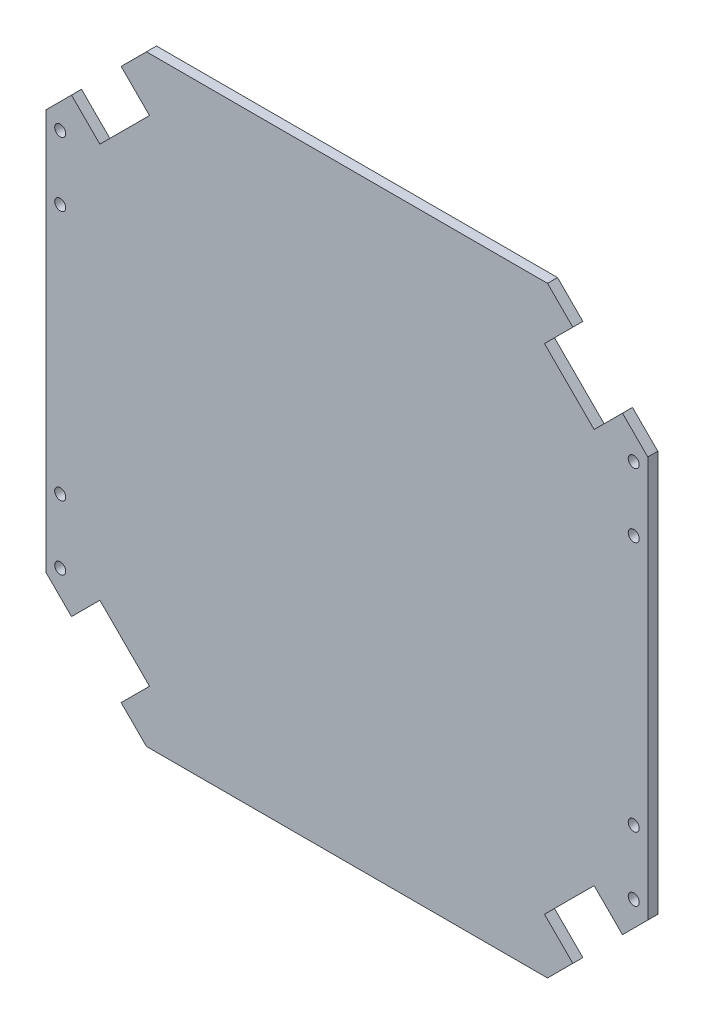
ISO-10303-21;
HEADER;
FILE_DESCRIPTION(('STEP AP214'),'2;1');
FILE_NAME('part.step','',(''),(''),'','','');
FILE_SCHEMA(('AUTOMOTIVE_DESIGN { 1 0 10303 214 1 1 1 1 }'));
ENDSEC;
DATA;
#1=APPLICATION_CONTEXT('core data for automotive mechanical design processes');
#2=APPLICATION_PROTOCOL_DEFINITION('international standard','automotive_design',2000,#1);
#3=PRODUCT_CONTEXT('',#1,'mechanical');
#4=PRODUCT('Part','Part','',(#3));
#5=PRODUCT_RELATED_PRODUCT_CATEGORY('part','',(#4));
#6=PRODUCT_DEFINITION_FORMATION('','',#4);
#7=PRODUCT_DEFINITION_CONTEXT('part definition',#1,'design');
#8=PRODUCT_DEFINITION('design','',#6,#7);
#9=PRODUCT_DEFINITION_SHAPE('','',#8);
#10=(LENGTH_UNIT() NAMED_UNIT(*) SI_UNIT(.MILLI.,.METRE.));
#11=(NAMED_UNIT(*) PLANE_ANGLE_UNIT() SI_UNIT($,.RADIAN.));
#12=(NAMED_UNIT(*) SI_UNIT($,.STERADIAN.) SOLID_ANGLE_UNIT());
#13=UNCERTAINTY_MEASURE_WITH_UNIT(LENGTH_MEASURE(1.E-05),#10,'distance_accuracy_value','');
#14=(GEOMETRIC_REPRESENTATION_CONTEXT(3) GLOBAL_UNCERTAINTY_ASSIGNED_CONTEXT((#13)) GLOBAL_UNIT_ASSIGNED_CONTEXT((#10,
#11,#12)) REPRESENTATION_CONTEXT('',''));
#15=CARTESIAN_POINT('',(0.,0.,0.));
#16=DIRECTION('',(0.,0.,1.));
#17=DIRECTION('',(1.,0.,0.));
#18=AXIS2_PLACEMENT_3D('',#15,#16,#17);
#19=CARTESIAN_POINT('',(110.857864376269,-110.85786437627,5.));
#20=DIRECTION('',(0.707106781186543,-0.707106781186552,0.));
#21=DIRECTION('',(0.707106781186552,0.707106781186543,0.));
#22=AXIS2_PLACEMENT_3D('',#19,#20,#21);
#23=PLANE('',#22);
#24=DIRECTION('',(-0.707106781186552,-0.707106781186543,0.));
#25=VECTOR('',#24,1.);
#26=CARTESIAN_POINT('',(110.857864376269,-110.85786437627,0.));
#27=LINE('',#26,#25);
#28=CARTESIAN_POINT('',(123.232233047034,-98.4834957055048,0.));
#29=VERTEX_POINT('',#28);
#30=CARTESIAN_POINT('',(98.4834957055044,-123.232233047034,0.));
#31=VERTEX_POINT('',#30);
#32=EDGE_CURVE('E232',#29,#31,#27,.T.);
#33=ORIENTED_EDGE('',*,*,#32,.F.);
#34=DIRECTION('',(0.,0.,-1.));
#35=VECTOR('',#34,1.);
#36=CARTESIAN_POINT('',(123.232233047034,-98.4834957055048,5.));
#37=LINE('',#36,#35);
#38=CARTESIAN_POINT('',(123.232233047034,-98.4834957055048,5.));
#39=VERTEX_POINT('',#38);
#40=EDGE_CURVE('E11',#39,#29,#37,.T.);
#41=ORIENTED_EDGE('',*,*,#40,.F.);
#42=DIRECTION('',(-0.707106781186552,-0.707106781186543,0.));
#43=VECTOR('',#42,1.);
#44=CARTESIAN_POINT('',(110.857864376269,-110.85786437627,5.));
#45=LINE('',#44,#43);
#46=CARTESIAN_POINT('',(98.4834957055044,-123.232233047034,5.));
#47=VERTEX_POINT('',#46);
#48=EDGE_CURVE('E288',#39,#47,#45,.T.);
#49=ORIENTED_EDGE('',*,*,#48,.T.);
#50=DIRECTION('',(0.,0.,-1.));
#51=VECTOR('',#50,1.);
#52=CARTESIAN_POINT('',(98.4834957055044,-123.232233047034,5.));
#53=LINE('',#52,#51);
#54=EDGE_CURVE('E55',#47,#31,#53,.T.);
#55=ORIENTED_EDGE('',*,*,#54,.T.);
#56=EDGE_LOOP('',(#33,#41,#49,#55));
#57=FACE_BOUND('',#56,.T.);
#58=ADVANCED_FACE('F39',(#57),#23,.T.);
#59=CARTESIAN_POINT('',(12.3743686707649,12.3743686707648,5.));
#60=DIRECTION('',(-0.70710678118655,-0.707106781186545,0.));
#61=DIRECTION('',(0.707106781186545,-0.70710678118655,0.));
#62=AXIS2_PLACEMENT_3D('',#59,#60,#61);
#63=PLANE('',#62);
#64=DIRECTION('',(-0.707106781186545,0.70710678118655,0.));
#65=VECTOR('',#64,1.);
#66=CARTESIAN_POINT('',(12.3743686707649,12.3743686707648,0.));
#67=LINE('',#66,#65);
#68=CARTESIAN_POINT('',(137.374368670765,-112.625631329236,0.));
#69=VERTEX_POINT('',#68);
#70=EDGE_CURVE('E234',#69,#29,#67,.T.);
#71=ORIENTED_EDGE('',*,*,#70,.F.);
#72=DIRECTION('',(0.,0.,-1.));
#73=VECTOR('',#72,1.);
#74=CARTESIAN_POINT('',(137.374368670765,-112.625631329236,5.));
#75=LINE('',#74,#73);
#76=CARTESIAN_POINT('',(137.374368670765,-112.625631329236,5.));
#77=VERTEX_POINT('',#76);
#78=EDGE_CURVE('E47',#77,#69,#75,.T.);
#79=ORIENTED_EDGE('',*,*,#78,.F.);
#80=DIRECTION('',(-0.707106781186545,0.70710678118655,0.));
#81=VECTOR('',#80,1.);
#82=CARTESIAN_POINT('',(12.3743686707649,12.3743686707648,5.));
#83=LINE('',#82,#81);
#84=EDGE_CURVE('E346',#77,#39,#83,.T.);
#85=ORIENTED_EDGE('',*,*,#84,.T.);
#86=ORIENTED_EDGE('',*,*,#40,.T.);
#87=EDGE_LOOP('',(#71,#79,#85,#86));
#88=FACE_BOUND('',#87,.T.);
#89=ADVANCED_FACE('F345',(#88),#63,.T.);
#90=CARTESIAN_POINT('',(124.999999999999,-125.000000000001,5.));
#91=DIRECTION('',(-0.707106781186544,0.707106781186552,0.));
#92=DIRECTION('',(-0.707106781186551,-0.707106781186544,0.));
#93=AXIS2_PLACEMENT_3D('',#90,#91,#92);
#94=PLANE('',#93);
#95=DIRECTION('',(0.707106781186552,0.707106781186544,0.));
#96=VECTOR('',#95,1.);
#97=CARTESIAN_POINT('',(124.999999999999,-125.000000000001,0.));
#98=LINE('',#97,#96);
#99=CARTESIAN_POINT('',(150.,-100.000000000001,0.));
#100=VERTEX_POINT('',#99);
#101=EDGE_CURVE('E238',#69,#100,#98,.T.);
#102=ORIENTED_EDGE('',*,*,#101,.T.);
#103=DIRECTION('',(0.,0.,-1.));
#104=VECTOR('',#103,1.);
#105=CARTESIAN_POINT('',(150.,-100.000000000001,5.));
#106=LINE('',#105,#104);
#107=CARTESIAN_POINT('',(150.,-100.000000000001,5.));
#108=VERTEX_POINT('',#107);
#109=EDGE_CURVE('E331',#108,#100,#106,.T.);
#110=ORIENTED_EDGE('',*,*,#109,.F.);
#111=DIRECTION('',(0.707106781186552,0.707106781186544,0.));
#112=VECTOR('',#111,1.);
#113=CARTESIAN_POINT('',(124.999999999999,-125.000000000001,5.));
#114=LINE('',#113,#112);
#115=EDGE_CURVE('E219',#77,#108,#114,.T.);
#116=ORIENTED_EDGE('',*,*,#115,.F.);
#117=ORIENTED_EDGE('',*,*,#78,.T.);
#118=EDGE_LOOP('',(#102,#110,#116,#117));
#119=FACE_BOUND('',#118,.T.);
#120=ADVANCED_FACE('F336',(#119),#94,.F.);
#121=CARTESIAN_POINT('',(150.,0.,5.));
#122=DIRECTION('',(-1.,0.,0.));
#123=DIRECTION('',(0.,0.,1.));
#124=AXIS2_PLACEMENT_3D('',#121,#122,#123);
#125=PLANE('',#124);
#126=DIRECTION('',(0.,1.,0.));
#127=VECTOR('',#126,1.);
#128=CARTESIAN_POINT('',(150.,0.,0.));
#129=LINE('',#128,#127);
#130=CARTESIAN_POINT('',(150.,100.000000000001,0.));
#131=VERTEX_POINT('',#130);
#132=EDGE_CURVE('E240',#100,#131,#129,.T.);
#133=ORIENTED_EDGE('',*,*,#132,.T.);
#134=DIRECTION('',(0.,0.,-1.));
#135=VECTOR('',#134,1.);
#136=CARTESIAN_POINT('',(150.,100.000000000001,5.));
#137=LINE('',#136,#135);
#138=CARTESIAN_POINT('',(150.,100.000000000001,5.));
#139=VERTEX_POINT('',#138);
#140=EDGE_CURVE('E329',#139,#131,#137,.T.);
#141=ORIENTED_EDGE('',*,*,#140,.F.);
#142=DIRECTION('',(0.,1.,0.));
#143=VECTOR('',#142,1.);
#144=CARTESIAN_POINT('',(150.,0.,5.));
#145=LINE('',#144,#143);
#146=EDGE_CURVE('E572',#108,#139,#145,.T.);
#147=ORIENTED_EDGE('',*,*,#146,.F.);
#148=ORIENTED_EDGE('',*,*,#109,.T.);
#149=EDGE_LOOP('',(#133,#141,#147,#148));
#150=FACE_BOUND('',#149,.T.);
#151=ADVANCED_FACE('F366',(#150),#125,.F.);
#152=CARTESIAN_POINT('',(124.999999999999,125.000000000001,5.));
#153=DIRECTION('',(0.707106781186544,0.707106781186552,0.));
#154=DIRECTION('',(-0.707106781186551,0.707106781186544,0.));
#155=AXIS2_PLACEMENT_3D('',#152,#153,#154);
#156=PLANE('',#155);
#157=DIRECTION('',(0.707106781186552,-0.707106781186544,0.));
#158=VECTOR('',#157,1.);
#159=CARTESIAN_POINT('',(124.999999999999,125.000000000001,0.));
#160=LINE('',#159,#158);
#161=CARTESIAN_POINT('',(137.374368670765,112.625631329236,0.));
#162=VERTEX_POINT('',#161);
#163=EDGE_CURVE('E244',#162,#131,#160,.T.);
#164=ORIENTED_EDGE('',*,*,#163,.F.);
#165=DIRECTION('',(0.,0.,-1.));
#166=VECTOR('',#165,1.);
#167=CARTESIAN_POINT('',(137.374368670765,112.625631329236,5.));
#168=LINE('',#167,#166);
#169=CARTESIAN_POINT('',(137.374368670765,112.625631329236,5.));
#170=VERTEX_POINT('',#169);
#171=EDGE_CURVE('E327',#170,#162,#168,.T.);
#172=ORIENTED_EDGE('',*,*,#171,.F.);
#173=DIRECTION('',(0.707106781186552,-0.707106781186544,0.));
#174=VECTOR('',#173,1.);
#175=CARTESIAN_POINT('',(124.999999999999,125.000000000001,5.));
#176=LINE('',#175,#174);
#177=EDGE_CURVE('E574',#170,#139,#176,.T.);
#178=ORIENTED_EDGE('',*,*,#177,.T.);
#179=ORIENTED_EDGE('',*,*,#140,.T.);
#180=EDGE_LOOP('',(#164,#172,#178,#179));
#181=FACE_BOUND('',#180,.T.);
#182=ADVANCED_FACE('F370',(#181),#156,.T.);
#183=CARTESIAN_POINT('',(12.3743686707649,-12.3743686707648,5.));
#184=DIRECTION('',(0.70710678118655,-0.707106781186545,0.));
#185=DIRECTION('',(0.707106781186545,0.70710678118655,0.));
#186=AXIS2_PLACEMENT_3D('',#183,#184,#185);
#187=PLANE('',#186);
#188=DIRECTION('',(-0.707106781186545,-0.70710678118655,0.));
#189=VECTOR('',#188,1.);
#190=CARTESIAN_POINT('',(12.3743686707649,-12.3743686707648,0.));
#191=LINE('',#190,#189);
#192=CARTESIAN_POINT('',(123.232233047034,98.4834957055048,0.));
#193=VERTEX_POINT('',#192);
#194=EDGE_CURVE('E247',#162,#193,#191,.T.);
#195=ORIENTED_EDGE('',*,*,#194,.T.);
#196=DIRECTION('',(0.,0.,-1.));
#197=VECTOR('',#196,1.);
#198=CARTESIAN_POINT('',(123.232233047034,98.4834957055048,5.));
#199=LINE('',#198,#197);
#200=CARTESIAN_POINT('',(123.232233047034,98.4834957055048,5.));
#201=VERTEX_POINT('',#200);
#202=EDGE_CURVE('E324',#201,#193,#199,.T.);
#203=ORIENTED_EDGE('',*,*,#202,.F.);
#204=DIRECTION('',(-0.707106781186545,-0.70710678118655,0.));
#205=VECTOR('',#204,1.);
#206=CARTESIAN_POINT('',(12.3743686707649,-12.3743686707648,5.));
#207=LINE('',#206,#205);
#208=EDGE_CURVE('E577',#170,#201,#207,.T.);
#209=ORIENTED_EDGE('',*,*,#208,.F.);
#210=ORIENTED_EDGE('',*,*,#171,.T.);
#211=EDGE_LOOP('',(#195,#203,#209,#210));
#212=FACE_BOUND('',#211,.T.);
#213=ADVANCED_FACE('F372',(#212),#187,.F.);
#214=CARTESIAN_POINT('',(110.857864376269,110.85786437627,5.));
#215=DIRECTION('',(-0.707106781186543,-0.707106781186552,0.));
#216=DIRECTION('',(0.707106781186552,-0.707106781186543,0.));
#217=AXIS2_PLACEMENT_3D('',#214,#215,#216);
#218=PLANE('',#217);
#219=DIRECTION('',(-0.707106781186552,0.707106781186543,0.));
#220=VECTOR('',#219,1.);
#221=CARTESIAN_POINT('',(110.857864376269,110.85786437627,0.));
#222=LINE('',#221,#220);
#223=CARTESIAN_POINT('',(98.4834957055045,123.232233047034,0.));
#224=VERTEX_POINT('',#223);
#225=EDGE_CURVE('E250',#193,#224,#222,.T.);
#226=ORIENTED_EDGE('',*,*,#225,.T.);
#227=DIRECTION('',(0.,0.,-1.));
#228=VECTOR('',#227,1.);
#229=CARTESIAN_POINT('',(98.4834957055045,123.232233047034,5.));
#230=LINE('',#229,#228);
#231=CARTESIAN_POINT('',(98.4834957055045,123.232233047034,5.));
#232=VERTEX_POINT('',#231);
#233=EDGE_CURVE('E321',#232,#224,#230,.T.);
#234=ORIENTED_EDGE('',*,*,#233,.F.);
#235=DIRECTION('',(-0.707106781186552,0.707106781186543,0.));
#236=VECTOR('',#235,1.);
#237=CARTESIAN_POINT('',(110.857864376269,110.85786437627,5.));
#238=LINE('',#237,#236);
#239=EDGE_CURVE('E580',#201,#232,#238,.T.);
#240=ORIENTED_EDGE('',*,*,#239,.F.);
#241=ORIENTED_EDGE('',*,*,#202,.T.);
#242=EDGE_LOOP('',(#226,#234,#240,#241));
#243=FACE_BOUND('',#242,.T.);
#244=ADVANCED_FACE('F375',(#243),#218,.F.);
#245=CARTESIAN_POINT('',(-12.3743686707643,12.3743686707642,5.));
#246=DIRECTION('',(-0.707106781186551,0.707106781186544,0.));
#247=DIRECTION('',(-0.707106781186544,-0.707106781186551,0.));
#248=AXIS2_PLACEMENT_3D('',#245,#246,#247);
#249=PLANE('',#248);
#250=DIRECTION('',(0.707106781186544,0.707106781186551,0.));
#251=VECTOR('',#250,1.);
#252=CARTESIAN_POINT('',(-12.3743686707643,12.3743686707642,0.));
#253=LINE('',#252,#251);
#254=CARTESIAN_POINT('',(112.625631329235,137.374368670765,0.));
#255=VERTEX_POINT('',#254);
#256=EDGE_CURVE('E252',#224,#255,#253,.T.);
#257=ORIENTED_EDGE('',*,*,#256,.T.);
#258=DIRECTION('',(0.,0.,-1.));
#259=VECTOR('',#258,1.);
#260=CARTESIAN_POINT('',(112.625631329235,137.374368670765,5.));
#261=LINE('',#260,#259);
#262=CARTESIAN_POINT('',(112.625631329235,137.374368670765,5.));
#263=VERTEX_POINT('',#262);
#264=EDGE_CURVE('E319',#263,#255,#261,.T.);
#265=ORIENTED_EDGE('',*,*,#264,.F.);
#266=DIRECTION('',(0.707106781186544,0.707106781186551,0.));
#267=VECTOR('',#266,1.);
#268=CARTESIAN_POINT('',(-12.3743686707643,12.3743686707642,5.));
#269=LINE('',#268,#267);
#270=EDGE_CURVE('E582',#232,#263,#269,.T.);
#271=ORIENTED_EDGE('',*,*,#270,.F.);
#272=ORIENTED_EDGE('',*,*,#233,.T.);
#273=EDGE_LOOP('',(#257,#265,#271,#272));
#274=FACE_BOUND('',#273,.T.);
#275=ADVANCED_FACE('F379',(#274),#249,.F.);
#276=CARTESIAN_POINT('',(100.,150.,0.));
#277=VERTEX_POINT('',#276);
#278=EDGE_CURVE('E248',#277,#255,#160,.T.);
#279=ORIENTED_EDGE('',*,*,#278,.F.);
#280=DIRECTION('',(0.,0.,-1.));
#281=VECTOR('',#280,1.);
#282=CARTESIAN_POINT('',(100.,150.,5.));
#283=LINE('',#282,#281);
#284=CARTESIAN_POINT('',(100.,150.,5.));
#285=VERTEX_POINT('',#284);
#286=EDGE_CURVE('E317',#285,#277,#283,.T.);
#287=ORIENTED_EDGE('',*,*,#286,.F.);
#288=EDGE_CURVE('E578',#285,#263,#176,.T.);
#289=ORIENTED_EDGE('',*,*,#288,.T.);
#290=ORIENTED_EDGE('',*,*,#264,.T.);
#291=EDGE_LOOP('',(#279,#287,#289,#290));
#292=FACE_BOUND('',#291,.T.);
#293=ADVANCED_FACE('F383',(#292),#156,.T.);
#294=CARTESIAN_POINT('',(0.,150.,5.));
#295=DIRECTION('',(0.,-1.,0.));
#296=DIRECTION('',(1.,0.,0.));
#297=AXIS2_PLACEMENT_3D('',#294,#295,#296);
#298=PLANE('',#297);
#299=DIRECTION('',(-1.,0.,0.));
#300=VECTOR('',#299,1.);
#301=CARTESIAN_POINT('',(0.,150.,0.));
#302=LINE('',#301,#300);
#303=CARTESIAN_POINT('',(-100.,150.,0.));
#304=VERTEX_POINT('',#303);
#305=EDGE_CURVE('E255',#277,#304,#302,.T.);
#306=ORIENTED_EDGE('',*,*,#305,.T.);
#307=DIRECTION('',(0.,0.,-1.));
#308=VECTOR('',#307,1.);
#309=CARTESIAN_POINT('',(-100.,150.,5.));
#310=LINE('',#309,#308);
#311=CARTESIAN_POINT('',(-100.,150.,5.));
#312=VERTEX_POINT('',#311);
#313=EDGE_CURVE('E314',#312,#304,#310,.T.);
#314=ORIENTED_EDGE('',*,*,#313,.F.);
#315=DIRECTION('',(-1.,0.,0.));
#316=VECTOR('',#315,1.);
#317=CARTESIAN_POINT('',(0.,150.,5.));
#318=LINE('',#317,#316);
#319=EDGE_CURVE('E584',#285,#312,#318,.T.);
#320=ORIENTED_EDGE('',*,*,#319,.F.);
#321=ORIENTED_EDGE('',*,*,#286,.T.);
#322=EDGE_LOOP('',(#306,#314,#320,#321));
#323=FACE_BOUND('',#322,.T.);
#324=ADVANCED_FACE('F387',(#323),#298,.F.);
#325=CARTESIAN_POINT('',(-124.999999999999,125.000000000001,5.));
#326=DIRECTION('',(0.707106781186543,-0.707106781186552,0.));
#327=DIRECTION('',(0.707106781186552,0.707106781186543,0.));
#328=AXIS2_PLACEMENT_3D('',#325,#326,#327);
#329=PLANE('',#328);
#330=DIRECTION('',(-0.707106781186552,-0.707106781186543,0.));
#331=VECTOR('',#330,1.);
#332=CARTESIAN_POINT('',(-124.999999999999,125.000000000001,0.));
#333=LINE('',#332,#331);
#334=CARTESIAN_POINT('',(-112.625631329235,137.374368670765,0.));
#335=VERTEX_POINT('',#334);
#336=EDGE_CURVE('E257',#304,#335,#333,.T.);
#337=ORIENTED_EDGE('',*,*,#336,.T.);
#338=DIRECTION('',(0.,0.,-1.));
#339=VECTOR('',#338,1.);
#340=CARTESIAN_POINT('',(-112.625631329235,137.374368670765,5.));
#341=LINE('',#340,#339);
#342=CARTESIAN_POINT('',(-112.625631329235,137.374368670765,5.));
#343=VERTEX_POINT('',#342);
#344=EDGE_CURVE('E312',#343,#335,#341,.T.);
#345=ORIENTED_EDGE('',*,*,#344,.F.);
#346=DIRECTION('',(-0.707106781186552,-0.707106781186543,0.));
#347=VECTOR('',#346,1.);
#348=CARTESIAN_POINT('',(-124.999999999999,125.000000000001,5.));
#349=LINE('',#348,#347);
#350=EDGE_CURVE('E586',#312,#343,#349,.T.);
#351=ORIENTED_EDGE('',*,*,#350,.F.);
#352=ORIENTED_EDGE('',*,*,#313,.T.);
#353=EDGE_LOOP('',(#337,#345,#351,#352));
#354=FACE_BOUND('',#353,.T.);
#355=ADVANCED_FACE('F391',(#354),#329,.F.);
#356=CARTESIAN_POINT('',(12.3743686707643,12.3743686707642,5.));
#357=DIRECTION('',(-0.707106781186551,-0.707106781186544,0.));
#358=DIRECTION('',(0.707106781186544,-0.707106781186551,0.));
#359=AXIS2_PLACEMENT_3D('',#356,#357,#358);
#360=PLANE('',#359);
#361=DIRECTION('',(-0.707106781186544,0.707106781186551,0.));
#362=VECTOR('',#361,1.);
#363=CARTESIAN_POINT('',(12.3743686707643,12.3743686707642,0.));
#364=LINE('',#363,#362);
#365=CARTESIAN_POINT('',(-98.4834957055044,123.232233047034,0.));
#366=VERTEX_POINT('',#365);
#367=EDGE_CURVE('E260',#366,#335,#364,.T.);
#368=ORIENTED_EDGE('',*,*,#367,.F.);
#369=DIRECTION('',(0.,0.,-1.));
#370=VECTOR('',#369,1.);
#371=CARTESIAN_POINT('',(-98.4834957055044,123.232233047034,5.));
#372=LINE('',#371,#370);
#373=CARTESIAN_POINT('',(-98.4834957055044,123.232233047034,5.));
#374=VERTEX_POINT('',#373);
#375=EDGE_CURVE('E310',#374,#366,#372,.T.);
#376=ORIENTED_EDGE('',*,*,#375,.F.);
#377=DIRECTION('',(-0.707106781186544,0.707106781186551,0.));
#378=VECTOR('',#377,1.);
#379=CARTESIAN_POINT('',(12.3743686707643,12.3743686707642,5.));
#380=LINE('',#379,#378);
#381=EDGE_CURVE('E588',#374,#343,#380,.T.);
#382=ORIENTED_EDGE('',*,*,#381,.T.);
#383=ORIENTED_EDGE('',*,*,#344,.T.);
#384=EDGE_LOOP('',(#368,#376,#382,#383));
#385=FACE_BOUND('',#384,.T.);
#386=ADVANCED_FACE('F393',(#385),#360,.T.);
#387=CARTESIAN_POINT('',(-110.857864376268,110.85786437627,5.));
#388=DIRECTION('',(-0.707106781186543,0.707106781186552,0.));
#389=DIRECTION('',(-0.707106781186552,-0.707106781186543,0.));
#390=AXIS2_PLACEMENT_3D('',#387,#388,#389);
#391=PLANE('',#390);
#392=DIRECTION('',(0.707106781186552,0.707106781186543,0.));
#393=VECTOR('',#392,1.);
#394=CARTESIAN_POINT('',(-110.857864376268,110.85786437627,0.));
#395=LINE('',#394,#393);
#396=CARTESIAN_POINT('',(-123.232233047031,98.4834957055074,0.));
#397=VERTEX_POINT('',#396);
#398=EDGE_CURVE('E264',#397,#366,#395,.T.);
#399=ORIENTED_EDGE('',*,*,#398,.F.);
#400=DIRECTION('',(0.,0.,-1.));
#401=VECTOR('',#400,1.);
#402=CARTESIAN_POINT('',(-123.232233047031,98.4834957055074,5.));
#403=LINE('',#402,#401);
#404=CARTESIAN_POINT('',(-123.232233047031,98.4834957055074,5.));
#405=VERTEX_POINT('',#404);
#406=EDGE_CURVE('E308',#405,#397,#403,.T.);
#407=ORIENTED_EDGE('',*,*,#406,.F.);
#408=DIRECTION('',(0.707106781186552,0.707106781186543,0.));
#409=VECTOR('',#408,1.);
#410=CARTESIAN_POINT('',(-110.857864376268,110.85786437627,5.));
#411=LINE('',#410,#409);
#412=EDGE_CURVE('E592',#405,#374,#411,.T.);
#413=ORIENTED_EDGE('',*,*,#412,.T.);
#414=ORIENTED_EDGE('',*,*,#375,.T.);
#415=EDGE_LOOP('',(#399,#407,#413,#414));
#416=FACE_BOUND('',#415,.T.);
#417=ADVANCED_FACE('F396',(#416),#391,.T.);
#418=CARTESIAN_POINT('',(-12.3743686707626,-12.3743686707625,5.));
#419=DIRECTION('',(0.707106781186552,0.707106781186543,0.));
#420=DIRECTION('',(-0.707106781186543,0.707106781186552,0.));
#421=AXIS2_PLACEMENT_3D('',#418,#419,#420);
#422=PLANE('',#421);
#423=DIRECTION('',(0.707106781186543,-0.707106781186552,0.));
#424=VECTOR('',#423,1.);
#425=CARTESIAN_POINT('',(-12.3743686707626,-12.3743686707625,0.));
#426=LINE('',#425,#424);
#427=CARTESIAN_POINT('',(-137.374368670762,112.625631329238,0.));
#428=VERTEX_POINT('',#427);
#429=EDGE_CURVE('E267',#428,#397,#426,.T.);
#430=ORIENTED_EDGE('',*,*,#429,.F.);
#431=DIRECTION('',(0.,0.,-1.));
#432=VECTOR('',#431,1.);
#433=CARTESIAN_POINT('',(-137.374368670762,112.625631329238,5.));
#434=LINE('',#433,#432);
#435=CARTESIAN_POINT('',(-137.374368670762,112.625631329238,5.));
#436=VERTEX_POINT('',#435);
#437=EDGE_CURVE('E306',#436,#428,#434,.T.);
#438=ORIENTED_EDGE('',*,*,#437,.F.);
#439=DIRECTION('',(0.707106781186543,-0.707106781186552,0.));
#440=VECTOR('',#439,1.);
#441=CARTESIAN_POINT('',(-12.3743686707626,-12.3743686707625,5.));
#442=LINE('',#441,#440);
#443=EDGE_CURVE('E595',#436,#405,#442,.T.);
#444=ORIENTED_EDGE('',*,*,#443,.T.);
#445=ORIENTED_EDGE('',*,*,#406,.T.);
#446=EDGE_LOOP('',(#430,#438,#444,#445));
#447=FACE_BOUND('',#446,.T.);
#448=ADVANCED_FACE('F400',(#447),#422,.T.);
#449=CARTESIAN_POINT('',(-150.,100.000000000001,0.));
#450=VERTEX_POINT('',#449);
#451=EDGE_CURVE('E261',#428,#450,#333,.T.);
#452=ORIENTED_EDGE('',*,*,#451,.T.);
#453=DIRECTION('',(0.,0.,-1.));
#454=VECTOR('',#453,1.);
#455=CARTESIAN_POINT('',(-150.,100.000000000001,5.));
#456=LINE('',#455,#454);
#457=CARTESIAN_POINT('',(-150.,100.000000000001,5.));
#458=VERTEX_POINT('',#457);
#459=EDGE_CURVE('E304',#458,#450,#456,.T.);
#460=ORIENTED_EDGE('',*,*,#459,.F.);
#461=EDGE_CURVE('E589',#436,#458,#349,.T.);
#462=ORIENTED_EDGE('',*,*,#461,.F.);
#463=ORIENTED_EDGE('',*,*,#437,.T.);
#464=EDGE_LOOP('',(#452,#460,#462,#463));
#465=FACE_BOUND('',#464,.T.);
#466=ADVANCED_FACE('F404',(#465),#329,.F.);
#467=CARTESIAN_POINT('',(-150.,0.,5.));
#468=DIRECTION('',(-1.,0.,0.));
#469=DIRECTION('',(0.,0.,1.));
#470=AXIS2_PLACEMENT_3D('',#467,#468,#469);
#471=PLANE('',#470);
#472=DIRECTION('',(0.,1.,0.));
#473=VECTOR('',#472,1.);
#474=CARTESIAN_POINT('',(-150.,0.,0.));
#475=LINE('',#474,#473);
#476=CARTESIAN_POINT('',(-150.,-100.000000000001,0.));
#477=VERTEX_POINT('',#476);
#478=EDGE_CURVE('E270',#477,#450,#475,.T.);
#479=ORIENTED_EDGE('',*,*,#478,.F.);
#480=DIRECTION('',(0.,0.,-1.));
#481=VECTOR('',#480,1.);
#482=CARTESIAN_POINT('',(-150.,-100.000000000001,5.));
#483=LINE('',#482,#481);
#484=CARTESIAN_POINT('',(-150.,-100.000000000001,5.));
#485=VERTEX_POINT('',#484);
#486=EDGE_CURVE('E302',#485,#477,#483,.T.);
#487=ORIENTED_EDGE('',*,*,#486,.F.);
#488=DIRECTION('',(0.,1.,0.));
#489=VECTOR('',#488,1.);
#490=CARTESIAN_POINT('',(-150.,0.,5.));
#491=LINE('',#490,#489);
#492=EDGE_CURVE('E598',#485,#458,#491,.T.);
#493=ORIENTED_EDGE('',*,*,#492,.T.);
#494=ORIENTED_EDGE('',*,*,#459,.T.);
#495=EDGE_LOOP('',(#479,#487,#493,#494));
#496=FACE_BOUND('',#495,.T.);
#497=ADVANCED_FACE('F408',(#496),#471,.T.);
#498=CARTESIAN_POINT('',(-124.999999999999,-125.000000000001,5.));
#499=DIRECTION('',(-0.707106781186543,-0.707106781186552,0.));
#500=DIRECTION('',(0.707106781186552,-0.707106781186543,0.));
#501=AXIS2_PLACEMENT_3D('',#498,#499,#500);
#502=PLANE('',#501);
#503=DIRECTION('',(-0.707106781186552,0.707106781186543,0.));
#504=VECTOR('',#503,1.);
#505=CARTESIAN_POINT('',(-124.999999999999,-125.000000000001,0.));
#506=LINE('',#505,#504);
#507=CARTESIAN_POINT('',(-137.374368670765,-112.625631329236,0.));
#508=VERTEX_POINT('',#507);
#509=EDGE_CURVE('E273',#508,#477,#506,.T.);
#510=ORIENTED_EDGE('',*,*,#509,.F.);
#511=DIRECTION('',(0.,0.,-1.));
#512=VECTOR('',#511,1.);
#513=CARTESIAN_POINT('',(-137.374368670765,-112.625631329236,5.));
#514=LINE('',#513,#512);
#515=CARTESIAN_POINT('',(-137.374368670765,-112.625631329236,5.));
#516=VERTEX_POINT('',#515);
#517=EDGE_CURVE('E300',#516,#508,#514,.T.);
#518=ORIENTED_EDGE('',*,*,#517,.F.);
#519=DIRECTION('',(-0.707106781186552,0.707106781186543,0.));
#520=VECTOR('',#519,1.);
#521=CARTESIAN_POINT('',(-124.999999999999,-125.000000000001,5.));
#522=LINE('',#521,#520);
#523=EDGE_CURVE('E227',#516,#485,#522,.T.);
#524=ORIENTED_EDGE('',*,*,#523,.T.);
#525=ORIENTED_EDGE('',*,*,#486,.T.);
#526=EDGE_LOOP('',(#510,#518,#524,#525));
#527=FACE_BOUND('',#526,.T.);
#528=ADVANCED_FACE('F412',(#527),#502,.T.);
#529=CARTESIAN_POINT('',(-12.3743686707644,12.3743686707644,5.));
#530=DIRECTION('',(-0.707106781186547,0.707106781186548,0.));
#531=DIRECTION('',(-0.707106781186548,-0.707106781186547,0.));
#532=AXIS2_PLACEMENT_3D('',#529,#530,#531);
#533=PLANE('',#532);
#534=DIRECTION('',(0.707106781186548,0.707106781186547,0.));
#535=VECTOR('',#534,1.);
#536=CARTESIAN_POINT('',(-12.3743686707644,12.3743686707644,0.));
#537=LINE('',#536,#535);
#538=CARTESIAN_POINT('',(-123.232233047034,-98.4834957055048,0.));
#539=VERTEX_POINT('',#538);
#540=EDGE_CURVE('E276',#508,#539,#537,.T.);
#541=ORIENTED_EDGE('',*,*,#540,.T.);
#542=DIRECTION('',(0.,0.,-1.));
#543=VECTOR('',#542,1.);
#544=CARTESIAN_POINT('',(-123.232233047034,-98.4834957055048,5.));
#545=LINE('',#544,#543);
#546=CARTESIAN_POINT('',(-123.232233047034,-98.4834957055048,5.));
#547=VERTEX_POINT('',#546);
#548=EDGE_CURVE('E297',#547,#539,#545,.T.);
#549=ORIENTED_EDGE('',*,*,#548,.F.);
#550=DIRECTION('',(0.707106781186548,0.707106781186547,0.));
#551=VECTOR('',#550,1.);
#552=CARTESIAN_POINT('',(-12.3743686707644,12.3743686707644,5.));
#553=LINE('',#552,#551);
#554=EDGE_CURVE('E602',#516,#547,#553,.T.);
#555=ORIENTED_EDGE('',*,*,#554,.F.);
#556=ORIENTED_EDGE('',*,*,#517,.T.);
#557=EDGE_LOOP('',(#541,#549,#555,#556));
#558=FACE_BOUND('',#557,.T.);
#559=ADVANCED_FACE('F414',(#558),#533,.F.);
#560=CARTESIAN_POINT('',(-110.857864376269,-110.85786437627,5.));
#561=DIRECTION('',(0.707106781186544,0.707106781186551,0.));
#562=DIRECTION('',(-0.707106781186551,0.707106781186544,0.));
#563=AXIS2_PLACEMENT_3D('',#560,#561,#562);
#564=PLANE('',#563);
#565=DIRECTION('',(0.707106781186551,-0.707106781186544,0.));
#566=VECTOR('',#565,1.);
#567=CARTESIAN_POINT('',(-110.857864376269,-110.85786437627,0.));
#568=LINE('',#567,#566);
#569=CARTESIAN_POINT('',(-98.4834957055044,-123.232233047034,0.));
#570=VERTEX_POINT('',#569);
#571=EDGE_CURVE('E279',#539,#570,#568,.T.);
#572=ORIENTED_EDGE('',*,*,#571,.T.);
#573=DIRECTION('',(0.,0.,-1.));
#574=VECTOR('',#573,1.);
#575=CARTESIAN_POINT('',(-98.4834957055044,-123.232233047034,5.));
#576=LINE('',#575,#574);
#577=CARTESIAN_POINT('',(-98.4834957055044,-123.232233047034,5.));
#578=VERTEX_POINT('',#577);
#579=EDGE_CURVE('E294',#578,#570,#576,.T.);
#580=ORIENTED_EDGE('',*,*,#579,.F.);
#581=DIRECTION('',(0.707106781186551,-0.707106781186544,0.));
#582=VECTOR('',#581,1.);
#583=CARTESIAN_POINT('',(-110.857864376269,-110.85786437627,5.));
#584=LINE('',#583,#582);
#585=EDGE_CURVE('E603',#547,#578,#584,.T.);
#586=ORIENTED_EDGE('',*,*,#585,.F.);
#587=ORIENTED_EDGE('',*,*,#548,.T.);
#588=EDGE_LOOP('',(#572,#580,#586,#587));
#589=FACE_BOUND('',#588,.T.);
#590=ADVANCED_FACE('F417',(#589),#564,.F.);
#591=CARTESIAN_POINT('',(12.3743686707643,-12.3743686707642,5.));
#592=DIRECTION('',(0.707106781186551,-0.707106781186544,0.));
#593=DIRECTION('',(0.707106781186544,0.707106781186551,0.));
#594=AXIS2_PLACEMENT_3D('',#591,#592,#593);
#595=PLANE('',#594);
#596=DIRECTION('',(-0.707106781186544,-0.707106781186551,0.));
#597=VECTOR('',#596,1.);
#598=CARTESIAN_POINT('',(12.3743686707643,-12.3743686707642,0.));
#599=LINE('',#598,#597);
#600=CARTESIAN_POINT('',(-112.625631329235,-137.374368670765,0.));
#601=VERTEX_POINT('',#600);
#602=EDGE_CURVE('E281',#570,#601,#599,.T.);
#603=ORIENTED_EDGE('',*,*,#602,.T.);
#604=DIRECTION('',(0.,0.,-1.));
#605=VECTOR('',#604,1.);
#606=CARTESIAN_POINT('',(-112.625631329235,-137.374368670765,5.));
#607=LINE('',#606,#605);
#608=CARTESIAN_POINT('',(-112.625631329235,-137.374368670765,5.));
#609=VERTEX_POINT('',#608);
#610=EDGE_CURVE('E292',#609,#601,#607,.T.);
#611=ORIENTED_EDGE('',*,*,#610,.F.);
#612=DIRECTION('',(-0.707106781186544,-0.707106781186551,0.));
#613=VECTOR('',#612,1.);
#614=CARTESIAN_POINT('',(12.3743686707643,-12.3743686707642,5.));
#615=LINE('',#614,#613);
#616=EDGE_CURVE('E225',#578,#609,#615,.T.);
#617=ORIENTED_EDGE('',*,*,#616,.F.);
#618=ORIENTED_EDGE('',*,*,#579,.T.);
#619=EDGE_LOOP('',(#603,#611,#617,#618));
#620=FACE_BOUND('',#619,.T.);
#621=ADVANCED_FACE('F421',(#620),#595,.F.);
#622=CARTESIAN_POINT('',(-100.,-150.,0.));
#623=VERTEX_POINT('',#622);
#624=EDGE_CURVE('E277',#623,#601,#506,.T.);
#625=ORIENTED_EDGE('',*,*,#624,.F.);
#626=DIRECTION('',(0.,0.,-1.));
#627=VECTOR('',#626,1.);
#628=CARTESIAN_POINT('',(-100.,-150.,5.));
#629=LINE('',#628,#627);
#630=CARTESIAN_POINT('',(-100.,-150.,5.));
#631=VERTEX_POINT('',#630);
#632=EDGE_CURVE('E211',#631,#623,#629,.T.);
#633=ORIENTED_EDGE('',*,*,#632,.F.);
#634=EDGE_CURVE('E223',#631,#609,#522,.T.);
#635=ORIENTED_EDGE('',*,*,#634,.T.);
#636=ORIENTED_EDGE('',*,*,#610,.T.);
#637=EDGE_LOOP('',(#625,#633,#635,#636));
#638=FACE_BOUND('',#637,.T.);
#639=ADVANCED_FACE('F425',(#638),#502,.T.);
#640=CARTESIAN_POINT('',(0.,-150.,5.));
#641=DIRECTION('',(0.,-1.,0.));
#642=DIRECTION('',(1.,0.,0.));
#643=AXIS2_PLACEMENT_3D('',#640,#641,#642);
#644=PLANE('',#643);
#645=DIRECTION('',(-1.,0.,0.));
#646=VECTOR('',#645,1.);
#647=CARTESIAN_POINT('',(0.,-150.,0.));
#648=LINE('',#647,#646);
#649=CARTESIAN_POINT('',(100.,-150.,0.));
#650=VERTEX_POINT('',#649);
#651=EDGE_CURVE('E208',#650,#623,#648,.T.);
#652=ORIENTED_EDGE('',*,*,#651,.F.);
#653=DIRECTION('',(0.,0.,-1.));
#654=VECTOR('',#653,1.);
#655=CARTESIAN_POINT('',(100.,-150.,5.));
#656=LINE('',#655,#654);
#657=CARTESIAN_POINT('',(100.,-150.,5.));
#658=VERTEX_POINT('',#657);
#659=EDGE_CURVE('E202',#658,#650,#656,.T.);
#660=ORIENTED_EDGE('',*,*,#659,.F.);
#661=DIRECTION('',(-1.,0.,0.));
#662=VECTOR('',#661,1.);
#663=CARTESIAN_POINT('',(0.,-150.,5.));
#664=LINE('',#663,#662);
#665=EDGE_CURVE('E206',#658,#631,#664,.T.);
#666=ORIENTED_EDGE('',*,*,#665,.T.);
#667=ORIENTED_EDGE('',*,*,#632,.T.);
#668=EDGE_LOOP('',(#652,#660,#666,#667));
#669=FACE_BOUND('',#668,.T.);
#670=ADVANCED_FACE('F204',(#669),#644,.T.);
#671=CARTESIAN_POINT('',(112.625631329235,-137.374368670765,0.));
#672=VERTEX_POINT('',#671);
#673=EDGE_CURVE('E241',#650,#672,#98,.T.);
#674=ORIENTED_EDGE('',*,*,#673,.T.);
#675=DIRECTION('',(0.,0.,-1.));
#676=VECTOR('',#675,1.);
#677=CARTESIAN_POINT('',(112.625631329235,-137.374368670765,5.));
#678=LINE('',#677,#676);
#679=CARTESIAN_POINT('',(112.625631329235,-137.374368670765,5.));
#680=VERTEX_POINT('',#679);
#681=EDGE_CURVE('E129',#680,#672,#678,.T.);
#682=ORIENTED_EDGE('',*,*,#681,.F.);
#683=EDGE_CURVE('E213',#658,#680,#114,.T.);
#684=ORIENTED_EDGE('',*,*,#683,.F.);
#685=ORIENTED_EDGE('',*,*,#659,.T.);
#686=EDGE_LOOP('',(#674,#682,#684,#685));
#687=FACE_BOUND('',#686,.T.);
#688=ADVANCED_FACE('F214',(#687),#94,.F.);
#689=CARTESIAN_POINT('',(-12.3743686707643,-12.3743686707642,5.));
#690=DIRECTION('',(0.707106781186551,0.707106781186544,0.));
#691=DIRECTION('',(-0.707106781186544,0.707106781186551,0.));
#692=AXIS2_PLACEMENT_3D('',#689,#690,#691);
#693=PLANE('',#692);
#694=DIRECTION('',(0.707106781186544,-0.707106781186551,0.));
#695=VECTOR('',#694,1.);
#696=CARTESIAN_POINT('',(-12.3743686707643,-12.3743686707642,0.));
#697=LINE('',#696,#695);
#698=EDGE_CURVE('E285',#31,#672,#697,.T.);
#699=ORIENTED_EDGE('',*,*,#698,.F.);
#700=ORIENTED_EDGE('',*,*,#54,.F.);
#701=DIRECTION('',(0.707106781186544,-0.707106781186551,0.));
#702=VECTOR('',#701,1.);
#703=CARTESIAN_POINT('',(-12.3743686707643,-12.3743686707642,5.));
#704=LINE('',#703,#702);
#705=EDGE_CURVE('E217',#47,#680,#704,.T.);
#706=ORIENTED_EDGE('',*,*,#705,.T.);
#707=ORIENTED_EDGE('',*,*,#681,.T.);
#708=EDGE_LOOP('',(#699,#700,#706,#707));
#709=FACE_BOUND('',#708,.T.);
#710=ADVANCED_FACE('F347',(#709),#693,.T.);
#711=CARTESIAN_POINT('',(0.,0.,5.));
#712=DIRECTION('',(0.,0.,1.));
#713=DIRECTION('',(1.,0.,0.));
#714=AXIS2_PLACEMENT_3D('',#711,#712,#713);
#715=PLANE('',#714);
#716=CARTESIAN_POINT('',(143.000000000013,-62.5000000002236,5.));
#717=DIRECTION('',(0.,0.,-1.));
#718=DIRECTION('',(-1.,0.,0.));
#719=AXIS2_PLACEMENT_3D('',#716,#717,#718);
#720=CIRCLE('',#719,2.75000000000001);
#721=CARTESIAN_POINT('',(140.250000000013,-62.5000000002236,5.));
#722=VERTEX_POINT('',#721);
#723=EDGE_CURVE('E539',#722,#722,#720,.T.);
#724=ORIENTED_EDGE('',*,*,#723,.T.);
#725=EDGE_LOOP('',(#724));
#726=FACE_BOUND('',#725,.T.);
#727=CARTESIAN_POINT('',(-142.999999999987,94.4999999997767,5.));
#728=DIRECTION('',(0.,0.,-1.));
#729=DIRECTION('',(-1.,0.,0.));
#730=AXIS2_PLACEMENT_3D('',#727,#728,#729);
#731=CIRCLE('',#730,2.75000000000001);
#732=CARTESIAN_POINT('',(-145.749999999987,94.4999999997767,5.));
#733=VERTEX_POINT('',#732);
#734=EDGE_CURVE('E565',#733,#733,#731,.T.);
#735=ORIENTED_EDGE('',*,*,#734,.T.);
#736=EDGE_LOOP('',(#735));
#737=FACE_BOUND('',#736,.T.);
#738=CARTESIAN_POINT('',(-142.999999999987,62.4999999997767,5.));
#739=DIRECTION('',(0.,0.,-1.));
#740=DIRECTION('',(-1.,0.,0.));
#741=AXIS2_PLACEMENT_3D('',#738,#739,#740);
#742=CIRCLE('',#741,2.74999999999998);
#743=CARTESIAN_POINT('',(-145.749999999987,62.4999999997767,5.));
#744=VERTEX_POINT('',#743);
#745=EDGE_CURVE('E559',#744,#744,#742,.T.);
#746=ORIENTED_EDGE('',*,*,#745,.T.);
#747=EDGE_LOOP('',(#746));
#748=FACE_BOUND('',#747,.T.);
#749=CARTESIAN_POINT('',(-142.999999999986,-94.5000000002307,5.));
#750=DIRECTION('',(0.,0.,-1.));
#751=DIRECTION('',(-1.,0.,0.));
#752=AXIS2_PLACEMENT_3D('',#749,#750,#751);
#753=CIRCLE('',#752,2.75000000000001);
#754=CARTESIAN_POINT('',(-145.749999999986,-94.5000000002307,5.));
#755=VERTEX_POINT('',#754);
#756=EDGE_CURVE('E552',#755,#755,#753,.T.);
#757=ORIENTED_EDGE('',*,*,#756,.T.);
#758=EDGE_LOOP('',(#757));
#759=FACE_BOUND('',#758,.T.);
#760=CARTESIAN_POINT('',(143.000000000013,-94.5000000002236,5.));
#761=DIRECTION('',(0.,0.,-1.));
#762=DIRECTION('',(-1.,0.,0.));
#763=AXIS2_PLACEMENT_3D('',#760,#761,#762);
#764=CIRCLE('',#763,2.75000000000001);
#765=CARTESIAN_POINT('',(140.250000000013,-94.5000000002236,5.));
#766=VERTEX_POINT('',#765);
#767=EDGE_CURVE('E543',#766,#766,#764,.T.);
#768=ORIENTED_EDGE('',*,*,#767,.T.);
#769=EDGE_LOOP('',(#768));
#770=FACE_BOUND('',#769,.T.);
#771=CARTESIAN_POINT('',(143.000000000013,62.4999999997598,5.));
#772=DIRECTION('',(0.,0.,-1.));
#773=DIRECTION('',(-1.,0.,0.));
#774=AXIS2_PLACEMENT_3D('',#771,#772,#773);
#775=CIRCLE('',#774,2.75000000000001);
#776=CARTESIAN_POINT('',(140.250000000013,62.4999999997598,5.));
#777=VERTEX_POINT('',#776);
#778=EDGE_CURVE('E802',#777,#777,#775,.T.);
#779=ORIENTED_EDGE('',*,*,#778,.T.);
#780=EDGE_LOOP('',(#779));
#781=FACE_BOUND('',#780,.T.);
#782=CARTESIAN_POINT('',(143.000000000013,94.4999999997598,5.));
#783=DIRECTION('',(0.,0.,-1.));
#784=DIRECTION('',(-1.,0.,0.));
#785=AXIS2_PLACEMENT_3D('',#782,#783,#784);
#786=CIRCLE('',#785,2.75000000000001);
#787=CARTESIAN_POINT('',(140.250000000013,94.4999999997598,5.));
#788=VERTEX_POINT('',#787);
#789=EDGE_CURVE('E796',#788,#788,#786,.T.);
#790=ORIENTED_EDGE('',*,*,#789,.T.);
#791=EDGE_LOOP('',(#790));
#792=FACE_BOUND('',#791,.T.);
#793=CARTESIAN_POINT('',(-142.999999999986,-62.5000000002307,5.));
#794=DIRECTION('',(0.,0.,-1.));
#795=DIRECTION('',(-1.,0.,0.));
#796=AXIS2_PLACEMENT_3D('',#793,#794,#795);
#797=CIRCLE('',#796,2.75000000000001);
#798=CARTESIAN_POINT('',(-145.749999999986,-62.5000000002307,5.));
#799=VERTEX_POINT('',#798);
#800=EDGE_CURVE('E235',#799,#799,#797,.T.);
#801=ORIENTED_EDGE('',*,*,#800,.T.);
#802=EDGE_LOOP('',(#801));
#803=FACE_BOUND('',#802,.T.);
#804=ORIENTED_EDGE('',*,*,#48,.F.);
#805=ORIENTED_EDGE('',*,*,#84,.F.);
#806=ORIENTED_EDGE('',*,*,#115,.T.);
#807=ORIENTED_EDGE('',*,*,#146,.T.);
#808=ORIENTED_EDGE('',*,*,#177,.F.);
#809=ORIENTED_EDGE('',*,*,#208,.T.);
#810=ORIENTED_EDGE('',*,*,#239,.T.);
#811=ORIENTED_EDGE('',*,*,#270,.T.);
#812=ORIENTED_EDGE('',*,*,#288,.F.);
#813=ORIENTED_EDGE('',*,*,#319,.T.);
#814=ORIENTED_EDGE('',*,*,#350,.T.);
#815=ORIENTED_EDGE('',*,*,#381,.F.);
#816=ORIENTED_EDGE('',*,*,#412,.F.);
#817=ORIENTED_EDGE('',*,*,#443,.F.);
#818=ORIENTED_EDGE('',*,*,#461,.T.);
#819=ORIENTED_EDGE('',*,*,#492,.F.);
#820=ORIENTED_EDGE('',*,*,#523,.F.);
#821=ORIENTED_EDGE('',*,*,#554,.T.);
#822=ORIENTED_EDGE('',*,*,#585,.T.);
#823=ORIENTED_EDGE('',*,*,#616,.T.);
#824=ORIENTED_EDGE('',*,*,#634,.F.);
#825=ORIENTED_EDGE('',*,*,#665,.F.);
#826=ORIENTED_EDGE('',*,*,#683,.T.);
#827=ORIENTED_EDGE('',*,*,#705,.F.);
#828=EDGE_LOOP('',(#804,#805,#806,#807,#808,#809,#810,#811,#812,#813,#814,#815,#816,#817,#818,
#819,#820,#821,#822,#823,#824,#825,#826,#827));
#829=FACE_BOUND('',#828,.T.);
#830=ADVANCED_FACE('F221',(#726,#737,#748,#759,#770,#781,#792,#803,#829),#715,.T.);
#831=CARTESIAN_POINT('',(0.,0.,0.));
#832=DIRECTION('',(0.,0.,1.));
#833=DIRECTION('',(1.,0.,0.));
#834=AXIS2_PLACEMENT_3D('',#831,#832,#833);
#835=PLANE('',#834);
#836=CARTESIAN_POINT('',(143.000000000013,-62.5000000002236,0.));
#837=DIRECTION('',(0.,0.,-1.));
#838=DIRECTION('',(-1.,0.,0.));
#839=AXIS2_PLACEMENT_3D('',#836,#837,#838);
#840=CIRCLE('',#839,2.75000000000001);
#841=CARTESIAN_POINT('',(140.250000000013,-62.5000000002236,0.));
#842=VERTEX_POINT('',#841);
#843=EDGE_CURVE('E542',#842,#842,#840,.T.);
#844=ORIENTED_EDGE('',*,*,#843,.F.);
#845=EDGE_LOOP('',(#844));
#846=FACE_BOUND('',#845,.T.);
#847=CARTESIAN_POINT('',(-142.999999999987,94.4999999997767,0.));
#848=DIRECTION('',(0.,0.,-1.));
#849=DIRECTION('',(-1.,0.,0.));
#850=AXIS2_PLACEMENT_3D('',#847,#848,#849);
#851=CIRCLE('',#850,2.75000000000001);
#852=CARTESIAN_POINT('',(-145.749999999987,94.4999999997767,0.));
#853=VERTEX_POINT('',#852);
#854=EDGE_CURVE('E545',#853,#853,#851,.T.);
#855=ORIENTED_EDGE('',*,*,#854,.F.);
#856=EDGE_LOOP('',(#855));
#857=FACE_BOUND('',#856,.T.);
#858=CARTESIAN_POINT('',(-142.999999999987,62.4999999997767,0.));
#859=DIRECTION('',(0.,0.,-1.));
#860=DIRECTION('',(-1.,0.,0.));
#861=AXIS2_PLACEMENT_3D('',#858,#859,#860);
#862=CIRCLE('',#861,2.74999999999998);
#863=CARTESIAN_POINT('',(-145.749999999987,62.4999999997767,0.));
#864=VERTEX_POINT('',#863);
#865=EDGE_CURVE('E562',#864,#864,#862,.T.);
#866=ORIENTED_EDGE('',*,*,#865,.F.);
#867=EDGE_LOOP('',(#866));
#868=FACE_BOUND('',#867,.T.);
#869=CARTESIAN_POINT('',(-142.999999999986,-94.5000000002307,0.));
#870=DIRECTION('',(0.,0.,-1.));
#871=DIRECTION('',(-1.,0.,0.));
#872=AXIS2_PLACEMENT_3D('',#869,#870,#871);
#873=CIRCLE('',#872,2.75000000000001);
#874=CARTESIAN_POINT('',(-145.749999999986,-94.5000000002307,0.));
#875=VERTEX_POINT('',#874);
#876=EDGE_CURVE('E556',#875,#875,#873,.T.);
#877=ORIENTED_EDGE('',*,*,#876,.F.);
#878=EDGE_LOOP('',(#877));
#879=FACE_BOUND('',#878,.T.);
#880=CARTESIAN_POINT('',(143.000000000013,-94.5000000002236,0.));
#881=DIRECTION('',(0.,0.,-1.));
#882=DIRECTION('',(-1.,0.,0.));
#883=AXIS2_PLACEMENT_3D('',#880,#881,#882);
#884=CIRCLE('',#883,2.75000000000001);
#885=CARTESIAN_POINT('',(140.250000000013,-94.5000000002236,0.));
#886=VERTEX_POINT('',#885);
#887=EDGE_CURVE('E548',#886,#886,#884,.T.);
#888=ORIENTED_EDGE('',*,*,#887,.F.);
#889=EDGE_LOOP('',(#888));
#890=FACE_BOUND('',#889,.T.);
#891=CARTESIAN_POINT('',(143.000000000013,62.4999999997598,0.));
#892=DIRECTION('',(0.,0.,-1.));
#893=DIRECTION('',(-1.,0.,0.));
#894=AXIS2_PLACEMENT_3D('',#891,#892,#893);
#895=CIRCLE('',#894,2.75000000000001);
#896=CARTESIAN_POINT('',(140.250000000013,62.4999999997598,0.));
#897=VERTEX_POINT('',#896);
#898=EDGE_CURVE('E799',#897,#897,#895,.T.);
#899=ORIENTED_EDGE('',*,*,#898,.F.);
#900=EDGE_LOOP('',(#899));
#901=FACE_BOUND('',#900,.T.);
#902=CARTESIAN_POINT('',(143.000000000013,94.4999999997598,0.));
#903=DIRECTION('',(0.,0.,-1.));
#904=DIRECTION('',(-1.,0.,0.));
#905=AXIS2_PLACEMENT_3D('',#902,#903,#904);
#906=CIRCLE('',#905,2.75000000000001);
#907=CARTESIAN_POINT('',(140.250000000013,94.4999999997598,0.));
#908=VERTEX_POINT('',#907);
#909=EDGE_CURVE('E793',#908,#908,#906,.T.);
#910=ORIENTED_EDGE('',*,*,#909,.F.);
#911=EDGE_LOOP('',(#910));
#912=FACE_BOUND('',#911,.T.);
#913=CARTESIAN_POINT('',(-142.999999999986,-62.5000000002307,0.));
#914=DIRECTION('',(0.,0.,-1.));
#915=DIRECTION('',(-1.,0.,0.));
#916=AXIS2_PLACEMENT_3D('',#913,#914,#915);
#917=CIRCLE('',#916,2.75000000000001);
#918=CARTESIAN_POINT('',(-145.749999999986,-62.5000000002307,0.));
#919=VERTEX_POINT('',#918);
#920=EDGE_CURVE('E555',#919,#919,#917,.T.);
#921=ORIENTED_EDGE('',*,*,#920,.F.);
#922=EDGE_LOOP('',(#921));
#923=FACE_BOUND('',#922,.T.);
#924=ORIENTED_EDGE('',*,*,#32,.T.);
#925=ORIENTED_EDGE('',*,*,#698,.T.);
#926=ORIENTED_EDGE('',*,*,#673,.F.);
#927=ORIENTED_EDGE('',*,*,#651,.T.);
#928=ORIENTED_EDGE('',*,*,#624,.T.);
#929=ORIENTED_EDGE('',*,*,#602,.F.);
#930=ORIENTED_EDGE('',*,*,#571,.F.);
#931=ORIENTED_EDGE('',*,*,#540,.F.);
#932=ORIENTED_EDGE('',*,*,#509,.T.);
#933=ORIENTED_EDGE('',*,*,#478,.T.);
#934=ORIENTED_EDGE('',*,*,#451,.F.);
#935=ORIENTED_EDGE('',*,*,#429,.T.);
#936=ORIENTED_EDGE('',*,*,#398,.T.);
#937=ORIENTED_EDGE('',*,*,#367,.T.);
#938=ORIENTED_EDGE('',*,*,#336,.F.);
#939=ORIENTED_EDGE('',*,*,#305,.F.);
#940=ORIENTED_EDGE('',*,*,#278,.T.);
#941=ORIENTED_EDGE('',*,*,#256,.F.);
#942=ORIENTED_EDGE('',*,*,#225,.F.);
#943=ORIENTED_EDGE('',*,*,#194,.F.);
#944=ORIENTED_EDGE('',*,*,#163,.T.);
#945=ORIENTED_EDGE('',*,*,#132,.F.);
#946=ORIENTED_EDGE('',*,*,#101,.F.);
#947=ORIENTED_EDGE('',*,*,#70,.T.);
#948=EDGE_LOOP('',(#924,#925,#926,#927,#928,#929,#930,#931,#932,#933,#934,#935,#936,#937,#938,
#939,#940,#941,#942,#943,#944,#945,#946,#947));
#949=FACE_BOUND('',#948,.T.);
#950=ADVANCED_FACE('F344',(#846,#857,#868,#879,#890,#901,#912,#923,#949),#835,.F.);
#951=CARTESIAN_POINT('',(-142.999999999986,-62.5000000002307,5.));
#952=DIRECTION('',(0.,0.,-1.));
#953=DIRECTION('',(-1.,0.,0.));
#954=AXIS2_PLACEMENT_3D('',#951,#952,#953);
#955=CYLINDRICAL_SURFACE('',#954,2.75000000000001);
#956=ORIENTED_EDGE('',*,*,#800,.F.);
#957=EDGE_LOOP('',(#956));
#958=FACE_BOUND('',#957,.T.);
#959=ORIENTED_EDGE('',*,*,#920,.T.);
#960=EDGE_LOOP('',(#959));
#961=FACE_BOUND('',#960,.T.);
#962=ADVANCED_FACE('F454',(#958,#961),#955,.F.);
#963=CARTESIAN_POINT('',(143.000000000013,94.4999999997598,5.));
#964=DIRECTION('',(0.,0.,-1.));
#965=DIRECTION('',(-1.,0.,0.));
#966=AXIS2_PLACEMENT_3D('',#963,#964,#965);
#967=CYLINDRICAL_SURFACE('',#966,2.75000000000001);
#968=ORIENTED_EDGE('',*,*,#789,.F.);
#969=EDGE_LOOP('',(#968));
#970=FACE_BOUND('',#969,.T.);
#971=ORIENTED_EDGE('',*,*,#909,.T.);
#972=EDGE_LOOP('',(#971));
#973=FACE_BOUND('',#972,.T.);
#974=ADVANCED_FACE('F462',(#970,#973),#967,.F.);
#975=CARTESIAN_POINT('',(143.000000000013,62.4999999997598,5.));
#976=DIRECTION('',(0.,0.,-1.));
#977=DIRECTION('',(-1.,0.,0.));
#978=AXIS2_PLACEMENT_3D('',#975,#976,#977);
#979=CYLINDRICAL_SURFACE('',#978,2.75000000000001);
#980=ORIENTED_EDGE('',*,*,#778,.F.);
#981=EDGE_LOOP('',(#980));
#982=FACE_BOUND('',#981,.T.);
#983=ORIENTED_EDGE('',*,*,#898,.T.);
#984=EDGE_LOOP('',(#983));
#985=FACE_BOUND('',#984,.T.);
#986=ADVANCED_FACE('F472',(#982,#985),#979,.F.);
#987=CARTESIAN_POINT('',(143.000000000013,-94.5000000002236,5.));
#988=DIRECTION('',(0.,0.,-1.));
#989=DIRECTION('',(-1.,0.,0.));
#990=AXIS2_PLACEMENT_3D('',#987,#988,#989);
#991=CYLINDRICAL_SURFACE('',#990,2.75000000000001);
#992=ORIENTED_EDGE('',*,*,#767,.F.);
#993=EDGE_LOOP('',(#992));
#994=FACE_BOUND('',#993,.T.);
#995=ORIENTED_EDGE('',*,*,#887,.T.);
#996=EDGE_LOOP('',(#995));
#997=FACE_BOUND('',#996,.T.);
#998=ADVANCED_FACE('F482',(#994,#997),#991,.F.);
#999=CARTESIAN_POINT('',(-142.999999999986,-94.5000000002307,5.));
#1000=DIRECTION('',(0.,0.,-1.));
#1001=DIRECTION('',(-1.,0.,0.));
#1002=AXIS2_PLACEMENT_3D('',#999,#1000,#1001);
#1003=CYLINDRICAL_SURFACE('',#1002,2.75000000000001);
#1004=ORIENTED_EDGE('',*,*,#756,.F.);
#1005=EDGE_LOOP('',(#1004));
#1006=FACE_BOUND('',#1005,.T.);
#1007=ORIENTED_EDGE('',*,*,#876,.T.);
#1008=EDGE_LOOP('',(#1007));
#1009=FACE_BOUND('',#1008,.T.);
#1010=ADVANCED_FACE('F492',(#1006,#1009),#1003,.F.);
#1011=CARTESIAN_POINT('',(-142.999999999987,62.4999999997767,5.));
#1012=DIRECTION('',(0.,0.,-1.));
#1013=DIRECTION('',(-1.,0.,0.));
#1014=AXIS2_PLACEMENT_3D('',#1011,#1012,#1013);
#1015=CYLINDRICAL_SURFACE('',#1014,2.74999999999998);
#1016=ORIENTED_EDGE('',*,*,#745,.F.);
#1017=EDGE_LOOP('',(#1016));
#1018=FACE_BOUND('',#1017,.T.);
#1019=ORIENTED_EDGE('',*,*,#865,.T.);
#1020=EDGE_LOOP('',(#1019));
#1021=FACE_BOUND('',#1020,.T.);
#1022=ADVANCED_FACE('F502',(#1018,#1021),#1015,.F.);
#1023=CARTESIAN_POINT('',(-142.999999999987,94.4999999997767,5.));
#1024=DIRECTION('',(0.,0.,-1.));
#1025=DIRECTION('',(-1.,0.,0.));
#1026=AXIS2_PLACEMENT_3D('',#1023,#1024,#1025);
#1027=CYLINDRICAL_SURFACE('',#1026,2.75000000000001);
#1028=ORIENTED_EDGE('',*,*,#734,.F.);
#1029=EDGE_LOOP('',(#1028));
#1030=FACE_BOUND('',#1029,.T.);
#1031=ORIENTED_EDGE('',*,*,#854,.T.);
#1032=EDGE_LOOP('',(#1031));
#1033=FACE_BOUND('',#1032,.T.);
#1034=ADVANCED_FACE('F512',(#1030,#1033),#1027,.F.);
#1035=CARTESIAN_POINT('',(143.000000000013,-62.5000000002236,5.));
#1036=DIRECTION('',(0.,0.,-1.));
#1037=DIRECTION('',(-1.,0.,0.));
#1038=AXIS2_PLACEMENT_3D('',#1035,#1036,#1037);
#1039=CYLINDRICAL_SURFACE('',#1038,2.75000000000001);
#1040=ORIENTED_EDGE('',*,*,#723,.F.);
#1041=EDGE_LOOP('',(#1040));
#1042=FACE_BOUND('',#1041,.T.);
#1043=ORIENTED_EDGE('',*,*,#843,.T.);
#1044=EDGE_LOOP('',(#1043));
#1045=FACE_BOUND('',#1044,.T.);
#1046=ADVANCED_FACE('F522',(#1042,#1045),#1039,.F.);
#1047=CLOSED_SHELL('',(#58,#89,#120,#151,#182,#213,#244,#275,#293,#324,#355,#386,#417,#448,#466,
#497,#528,#559,#590,#621,#639,#670,#688,#710,#830,#950,#962,#974,#986,#998,#1010,#1022,#1034,#1046));
#1048=MANIFOLD_SOLID_BREP('B2',#1047);
#1049=ADVANCED_BREP_SHAPE_REPRESENTATION('',(#18,#1048),#14);
#1050=SHAPE_DEFINITION_REPRESENTATION(#9,#1049);
ENDSEC;
END-ISO-10303-21;
